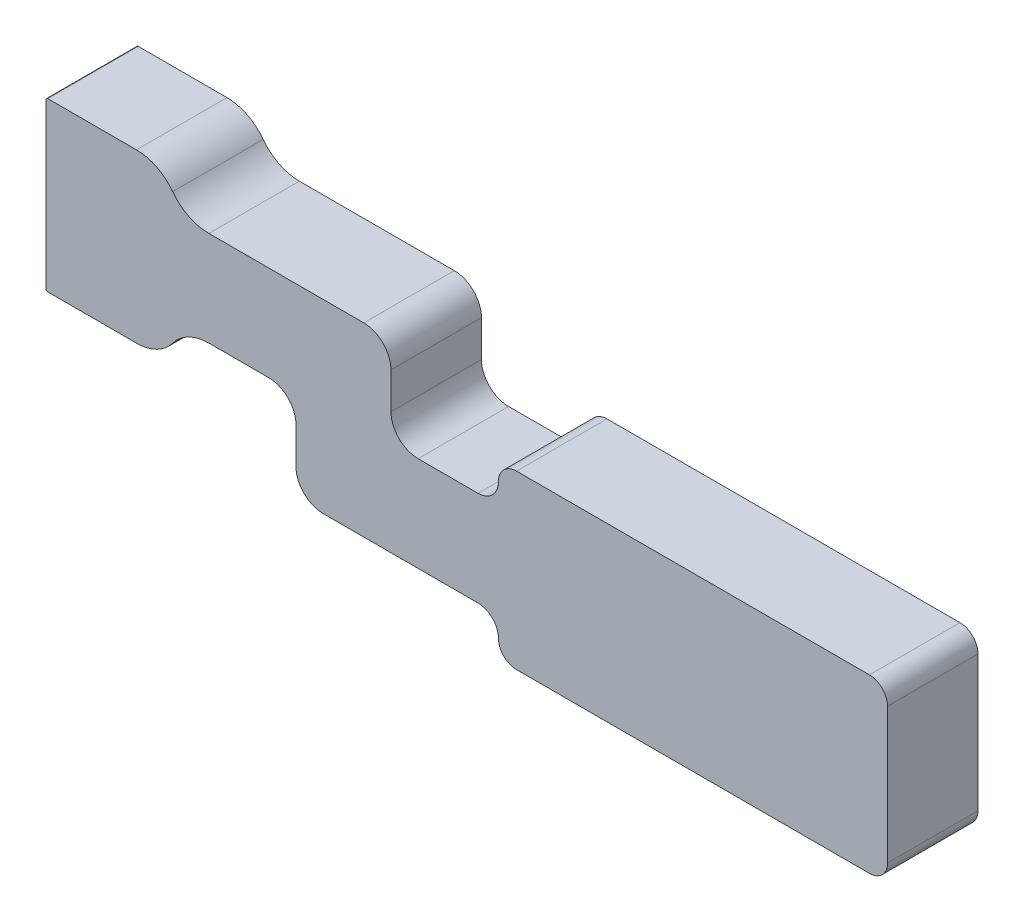
ISO-10303-21;
HEADER;
FILE_DESCRIPTION(('STEP AP214'),'2;1');
FILE_NAME('part.step','',(''),(''),'','','');
FILE_SCHEMA(('AUTOMOTIVE_DESIGN { 1 0 10303 214 1 1 1 1 }'));
ENDSEC;
DATA;
#1=APPLICATION_CONTEXT('core data for automotive mechanical design processes');
#2=APPLICATION_PROTOCOL_DEFINITION('international standard','automotive_design',2000,#1);
#3=PRODUCT_CONTEXT('',#1,'mechanical');
#4=PRODUCT('Part','Part','',(#3));
#5=PRODUCT_RELATED_PRODUCT_CATEGORY('part','',(#4));
#6=PRODUCT_DEFINITION_FORMATION('','',#4);
#7=PRODUCT_DEFINITION_CONTEXT('part definition',#1,'design');
#8=PRODUCT_DEFINITION('design','',#6,#7);
#9=PRODUCT_DEFINITION_SHAPE('','',#8);
#10=(LENGTH_UNIT() NAMED_UNIT(*) SI_UNIT(.MILLI.,.METRE.));
#11=(NAMED_UNIT(*) PLANE_ANGLE_UNIT() SI_UNIT($,.RADIAN.));
#12=(NAMED_UNIT(*) SI_UNIT($,.STERADIAN.) SOLID_ANGLE_UNIT());
#13=UNCERTAINTY_MEASURE_WITH_UNIT(LENGTH_MEASURE(1.E-05),#10,'distance_accuracy_value','');
#14=(GEOMETRIC_REPRESENTATION_CONTEXT(3) GLOBAL_UNCERTAINTY_ASSIGNED_CONTEXT((#13)) GLOBAL_UNIT_ASSIGNED_CONTEXT((#10,
#11,#12)) REPRESENTATION_CONTEXT('',''));
#15=CARTESIAN_POINT('',(0.,0.,0.));
#16=DIRECTION('',(0.,0.,1.));
#17=DIRECTION('',(1.,0.,0.));
#18=AXIS2_PLACEMENT_3D('',#15,#16,#17);
#19=CARTESIAN_POINT('',(3.40749254209706E-13,19.2499999999986,10.));
#20=DIRECTION('',(0.,-1.,0.));
#21=DIRECTION('',(1.,0.,0.));
#22=AXIS2_PLACEMENT_3D('',#19,#20,#21);
#23=PLANE('',#22);
#24=DIRECTION('',(-1.,0.,0.));
#25=VECTOR('',#24,1.);
#26=CARTESIAN_POINT('',(3.40749254209706E-13,19.2499999999986,0.));
#27=LINE('',#26,#25);
#28=CARTESIAN_POINT('',(-83.,19.25,0.));
#29=VERTEX_POINT('',#28);
#30=CARTESIAN_POINT('',(-92.8,19.2500000000002,0.));
#31=VERTEX_POINT('',#30);
#32=EDGE_CURVE('E260',#29,#31,#27,.T.);
#33=ORIENTED_EDGE('',*,*,#32,.T.);
#34=DIRECTION('',(0.,0.,-1.));
#35=VECTOR('',#34,1.);
#36=CARTESIAN_POINT('',(-92.8,19.2500000000002,10.));
#37=LINE('',#36,#35);
#38=CARTESIAN_POINT('',(-92.8,19.2500000000002,10.));
#39=VERTEX_POINT('',#38);
#40=EDGE_CURVE('E11',#39,#31,#37,.T.);
#41=ORIENTED_EDGE('',*,*,#40,.F.);
#42=DIRECTION('',(-1.,0.,0.));
#43=VECTOR('',#42,1.);
#44=CARTESIAN_POINT('',(3.40749254209706E-13,19.2499999999986,10.));
#45=LINE('',#44,#43);
#46=CARTESIAN_POINT('',(-83.,19.25,10.));
#47=VERTEX_POINT('',#46);
#48=EDGE_CURVE('E324',#47,#39,#45,.T.);
#49=ORIENTED_EDGE('',*,*,#48,.F.);
#50=DIRECTION('',(0.,0.,-1.));
#51=VECTOR('',#50,1.);
#52=CARTESIAN_POINT('',(-83.,19.25,10.));
#53=LINE('',#52,#51);
#54=EDGE_CURVE('E251',#47,#29,#53,.T.);
#55=ORIENTED_EDGE('',*,*,#54,.T.);
#56=EDGE_LOOP('',(#33,#41,#49,#55));
#57=FACE_BOUND('',#56,.T.);
#58=ADVANCED_FACE('F41',(#57),#23,.F.);
#59=CARTESIAN_POINT('',(-92.8,19.0500000000002,10.));
#60=DIRECTION('',(0.,0.,-1.));
#61=DIRECTION('',(-1.,0.,0.));
#62=AXIS2_PLACEMENT_3D('',#59,#60,#61);
#63=CYLINDRICAL_SURFACE('',#62,0.200000000000004);
#64=CARTESIAN_POINT('',(-92.8,19.0500000000002,0.));
#65=DIRECTION('',(0.,0.,1.));
#66=DIRECTION('',(1.,0.,0.));
#67=AXIS2_PLACEMENT_3D('',#64,#65,#66);
#68=CIRCLE('',#67,0.200000000000004);
#69=CARTESIAN_POINT('',(-93.,19.0500000000002,0.));
#70=VERTEX_POINT('',#69);
#71=EDGE_CURVE('E257',#31,#70,#68,.T.);
#72=ORIENTED_EDGE('',*,*,#71,.T.);
#73=DIRECTION('',(0.,0.,-1.));
#74=VECTOR('',#73,1.);
#75=CARTESIAN_POINT('',(-93.,19.0500000000002,10.));
#76=LINE('',#75,#74);
#77=CARTESIAN_POINT('',(-93.,19.0500000000002,10.));
#78=VERTEX_POINT('',#77);
#79=EDGE_CURVE('E47',#78,#70,#76,.T.);
#80=ORIENTED_EDGE('',*,*,#79,.F.);
#81=CARTESIAN_POINT('',(-92.8,19.0500000000002,10.));
#82=DIRECTION('',(0.,0.,1.));
#83=DIRECTION('',(1.,0.,0.));
#84=AXIS2_PLACEMENT_3D('',#81,#82,#83);
#85=CIRCLE('',#84,0.200000000000004);
#86=EDGE_CURVE('E159',#39,#78,#85,.T.);
#87=ORIENTED_EDGE('',*,*,#86,.F.);
#88=ORIENTED_EDGE('',*,*,#40,.T.);
#89=EDGE_LOOP('',(#72,#80,#87,#88));
#90=FACE_BOUND('',#89,.T.);
#91=ADVANCED_FACE('F474',(#90),#63,.T.);
#92=CARTESIAN_POINT('',(-93.,0.,10.));
#93=DIRECTION('',(1.,0.,0.));
#94=DIRECTION('',(0.,0.,-1.));
#95=AXIS2_PLACEMENT_3D('',#92,#93,#94);
#96=PLANE('',#95);
#97=DIRECTION('',(0.,-1.,0.));
#98=VECTOR('',#97,1.);
#99=CARTESIAN_POINT('',(-93.,0.,0.));
#100=LINE('',#99,#98);
#101=CARTESIAN_POINT('',(-93.,0.950000000000041,0.));
#102=VERTEX_POINT('',#101);
#103=EDGE_CURVE('E265',#70,#102,#100,.T.);
#104=ORIENTED_EDGE('',*,*,#103,.T.);
#105=DIRECTION('',(0.,0.,-1.));
#106=VECTOR('',#105,1.);
#107=CARTESIAN_POINT('',(-93.,0.950000000000041,10.));
#108=LINE('',#107,#106);
#109=CARTESIAN_POINT('',(-93.,0.950000000000041,10.));
#110=VERTEX_POINT('',#109);
#111=EDGE_CURVE('E377',#110,#102,#108,.T.);
#112=ORIENTED_EDGE('',*,*,#111,.F.);
#113=DIRECTION('',(0.,-1.,0.));
#114=VECTOR('',#113,1.);
#115=CARTESIAN_POINT('',(-93.,0.,10.));
#116=LINE('',#115,#114);
#117=EDGE_CURVE('E387',#78,#110,#116,.T.);
#118=ORIENTED_EDGE('',*,*,#117,.F.);
#119=ORIENTED_EDGE('',*,*,#79,.T.);
#120=EDGE_LOOP('',(#104,#112,#118,#119));
#121=FACE_BOUND('',#120,.T.);
#122=ADVANCED_FACE('F383',(#121),#96,.F.);
#123=CARTESIAN_POINT('',(-92.8,0.950000000000039,10.));
#124=DIRECTION('',(0.,0.,-1.));
#125=DIRECTION('',(-1.,0.,0.));
#126=AXIS2_PLACEMENT_3D('',#123,#124,#125);
#127=CYLINDRICAL_SURFACE('',#126,0.200000000000003);
#128=CARTESIAN_POINT('',(-92.8,0.950000000000039,0.));
#129=DIRECTION('',(0.,0.,1.));
#130=DIRECTION('',(1.,0.,0.));
#131=AXIS2_PLACEMENT_3D('',#128,#129,#130);
#132=CIRCLE('',#131,0.200000000000003);
#133=CARTESIAN_POINT('',(-92.8,0.750000000000039,0.));
#134=VERTEX_POINT('',#133);
#135=EDGE_CURVE('E264',#134,#102,#132,.F.);
#136=ORIENTED_EDGE('',*,*,#135,.F.);
#137=DIRECTION('',(0.,0.,-1.));
#138=VECTOR('',#137,1.);
#139=CARTESIAN_POINT('',(-92.8,0.750000000000039,10.));
#140=LINE('',#139,#138);
#141=CARTESIAN_POINT('',(-92.8,0.750000000000039,10.));
#142=VERTEX_POINT('',#141);
#143=EDGE_CURVE('E380',#142,#134,#140,.T.);
#144=ORIENTED_EDGE('',*,*,#143,.F.);
#145=CARTESIAN_POINT('',(-92.8,0.950000000000039,10.));
#146=DIRECTION('',(0.,0.,1.));
#147=DIRECTION('',(1.,0.,0.));
#148=AXIS2_PLACEMENT_3D('',#145,#146,#147);
#149=CIRCLE('',#148,0.200000000000003);
#150=EDGE_CURVE('E398',#142,#110,#149,.F.);
#151=ORIENTED_EDGE('',*,*,#150,.T.);
#152=ORIENTED_EDGE('',*,*,#111,.T.);
#153=EDGE_LOOP('',(#136,#144,#151,#152));
#154=FACE_BOUND('',#153,.T.);
#155=ADVANCED_FACE('F394',(#154),#127,.T.);
#156=CARTESIAN_POINT('',(0.,0.750000000000039,10.));
#157=DIRECTION('',(0.,-1.,0.));
#158=DIRECTION('',(0.,0.,-1.));
#159=AXIS2_PLACEMENT_3D('',#156,#157,#158);
#160=PLANE('',#159);
#161=DIRECTION('',(-1.,0.,0.));
#162=VECTOR('',#161,1.);
#163=CARTESIAN_POINT('',(0.,0.750000000000039,0.));
#164=LINE('',#163,#162);
#165=CARTESIAN_POINT('',(-83.,0.750000000000039,0.));
#166=VERTEX_POINT('',#165);
#167=EDGE_CURVE('E268',#166,#134,#164,.T.);
#168=ORIENTED_EDGE('',*,*,#167,.F.);
#169=DIRECTION('',(0.,0.,-1.));
#170=VECTOR('',#169,1.);
#171=CARTESIAN_POINT('',(-83.,0.750000000000039,10.));
#172=LINE('',#171,#170);
#173=CARTESIAN_POINT('',(-83.,0.750000000000039,10.));
#174=VERTEX_POINT('',#173);
#175=EDGE_CURVE('E374',#174,#166,#172,.T.);
#176=ORIENTED_EDGE('',*,*,#175,.F.);
#177=DIRECTION('',(-1.,0.,0.));
#178=VECTOR('',#177,1.);
#179=CARTESIAN_POINT('',(0.,0.750000000000039,10.));
#180=LINE('',#179,#178);
#181=EDGE_CURVE('E399',#174,#142,#180,.T.);
#182=ORIENTED_EDGE('',*,*,#181,.T.);
#183=ORIENTED_EDGE('',*,*,#143,.T.);
#184=EDGE_LOOP('',(#168,#176,#182,#183));
#185=FACE_BOUND('',#184,.T.);
#186=ADVANCED_FACE('F486',(#185),#160,.T.);
#187=CARTESIAN_POINT('',(-83.,5.75000000000004,10.));
#188=DIRECTION('',(0.,0.,-1.));
#189=DIRECTION('',(-1.,0.,0.));
#190=AXIS2_PLACEMENT_3D('',#187,#188,#189);
#191=CYLINDRICAL_SURFACE('',#190,5.);
#192=CARTESIAN_POINT('',(-83.,5.75000000000004,0.));
#193=DIRECTION('',(0.,0.,1.));
#194=DIRECTION('',(1.,0.,0.));
#195=AXIS2_PLACEMENT_3D('',#192,#193,#194);
#196=CIRCLE('',#195,5.);
#197=CARTESIAN_POINT('',(-79.,2.75000000000004,0.));
#198=VERTEX_POINT('',#197);
#199=EDGE_CURVE('E271',#198,#166,#196,.F.);
#200=ORIENTED_EDGE('',*,*,#199,.F.);
#201=DIRECTION('',(0.,0.,-1.));
#202=VECTOR('',#201,1.);
#203=CARTESIAN_POINT('',(-79.,2.75000000000004,10.));
#204=LINE('',#203,#202);
#205=CARTESIAN_POINT('',(-79.,2.75000000000004,10.));
#206=VERTEX_POINT('',#205);
#207=EDGE_CURVE('E373',#206,#198,#204,.T.);
#208=ORIENTED_EDGE('',*,*,#207,.F.);
#209=CARTESIAN_POINT('',(-83.,5.75000000000004,10.));
#210=DIRECTION('',(0.,0.,1.));
#211=DIRECTION('',(1.,0.,0.));
#212=AXIS2_PLACEMENT_3D('',#209,#210,#211);
#213=CIRCLE('',#212,5.);
#214=EDGE_CURVE('E402',#206,#174,#213,.F.);
#215=ORIENTED_EDGE('',*,*,#214,.T.);
#216=ORIENTED_EDGE('',*,*,#175,.T.);
#217=EDGE_LOOP('',(#200,#208,#215,#216));
#218=FACE_BOUND('',#217,.T.);
#219=ADVANCED_FACE('F487',(#218),#191,.T.);
#220=CARTESIAN_POINT('',(-75.,-0.249999999999962,10.));
#221=DIRECTION('',(0.,0.,-1.));
#222=DIRECTION('',(-1.,0.,0.));
#223=AXIS2_PLACEMENT_3D('',#220,#221,#222);
#224=CYLINDRICAL_SURFACE('',#223,5.);
#225=CARTESIAN_POINT('',(-75.,-0.249999999999962,0.));
#226=DIRECTION('',(0.,0.,1.));
#227=DIRECTION('',(1.,0.,0.));
#228=AXIS2_PLACEMENT_3D('',#225,#226,#227);
#229=CIRCLE('',#228,5.);
#230=CARTESIAN_POINT('',(-75.,4.75000000000004,0.));
#231=VERTEX_POINT('',#230);
#232=EDGE_CURVE('E273',#231,#198,#229,.T.);
#233=ORIENTED_EDGE('',*,*,#232,.F.);
#234=DIRECTION('',(0.,0.,-1.));
#235=VECTOR('',#234,1.);
#236=CARTESIAN_POINT('',(-75.,4.75000000000004,10.));
#237=LINE('',#236,#235);
#238=CARTESIAN_POINT('',(-75.,4.75000000000004,10.));
#239=VERTEX_POINT('',#238);
#240=EDGE_CURVE('E371',#239,#231,#237,.T.);
#241=ORIENTED_EDGE('',*,*,#240,.F.);
#242=CARTESIAN_POINT('',(-75.,-0.249999999999962,10.));
#243=DIRECTION('',(0.,0.,1.));
#244=DIRECTION('',(1.,0.,0.));
#245=AXIS2_PLACEMENT_3D('',#242,#243,#244);
#246=CIRCLE('',#245,5.);
#247=EDGE_CURVE('E409',#239,#206,#246,.T.);
#248=ORIENTED_EDGE('',*,*,#247,.T.);
#249=ORIENTED_EDGE('',*,*,#207,.T.);
#250=EDGE_LOOP('',(#233,#241,#248,#249));
#251=FACE_BOUND('',#250,.T.);
#252=ADVANCED_FACE('F492',(#251),#224,.F.);
#253=CARTESIAN_POINT('',(0.,4.75000000000004,10.));
#254=DIRECTION('',(0.,1.,0.));
#255=DIRECTION('',(0.,0.,1.));
#256=AXIS2_PLACEMENT_3D('',#253,#254,#255);
#257=PLANE('',#256);
#258=DIRECTION('',(1.,0.,0.));
#259=VECTOR('',#258,1.);
#260=CARTESIAN_POINT('',(0.,4.75000000000004,0.));
#261=LINE('',#260,#259);
#262=CARTESIAN_POINT('',(-68.375,4.75000000000004,0.));
#263=VERTEX_POINT('',#262);
#264=EDGE_CURVE('E280',#231,#263,#261,.T.);
#265=ORIENTED_EDGE('',*,*,#264,.T.);
#266=DIRECTION('',(0.,0.,-1.));
#267=VECTOR('',#266,1.);
#268=CARTESIAN_POINT('',(-68.375,4.75000000000004,10.));
#269=LINE('',#268,#267);
#270=CARTESIAN_POINT('',(-68.375,4.75000000000004,10.));
#271=VERTEX_POINT('',#270);
#272=EDGE_CURVE('E369',#271,#263,#269,.T.);
#273=ORIENTED_EDGE('',*,*,#272,.F.);
#274=DIRECTION('',(1.,0.,0.));
#275=VECTOR('',#274,1.);
#276=CARTESIAN_POINT('',(0.,4.75000000000004,10.));
#277=LINE('',#276,#275);
#278=EDGE_CURVE('E413',#239,#271,#277,.T.);
#279=ORIENTED_EDGE('',*,*,#278,.F.);
#280=ORIENTED_EDGE('',*,*,#240,.T.);
#281=EDGE_LOOP('',(#265,#273,#279,#280));
#282=FACE_BOUND('',#281,.T.);
#283=ADVANCED_FACE('F500',(#282),#257,.F.);
#284=CARTESIAN_POINT('',(-68.375,1.75000000000004,10.));
#285=DIRECTION('',(0.,0.,-1.));
#286=DIRECTION('',(-1.,0.,0.));
#287=AXIS2_PLACEMENT_3D('',#284,#285,#286);
#288=CYLINDRICAL_SURFACE('',#287,3.00000000000001);
#289=CARTESIAN_POINT('',(-68.375,1.75000000000004,0.));
#290=DIRECTION('',(0.,0.,1.));
#291=DIRECTION('',(1.,0.,0.));
#292=AXIS2_PLACEMENT_3D('',#289,#290,#291);
#293=CIRCLE('',#292,3.00000000000001);
#294=CARTESIAN_POINT('',(-65.375,1.75000000000004,0.));
#295=VERTEX_POINT('',#294);
#296=EDGE_CURVE('E278',#295,#263,#293,.T.);
#297=ORIENTED_EDGE('',*,*,#296,.F.);
#298=DIRECTION('',(0.,0.,-1.));
#299=VECTOR('',#298,1.);
#300=CARTESIAN_POINT('',(-65.375,1.75000000000004,10.));
#301=LINE('',#300,#299);
#302=CARTESIAN_POINT('',(-65.375,1.75000000000004,10.));
#303=VERTEX_POINT('',#302);
#304=EDGE_CURVE('E370',#303,#295,#301,.T.);
#305=ORIENTED_EDGE('',*,*,#304,.F.);
#306=CARTESIAN_POINT('',(-68.375,1.75000000000004,10.));
#307=DIRECTION('',(0.,0.,1.));
#308=DIRECTION('',(1.,0.,0.));
#309=AXIS2_PLACEMENT_3D('',#306,#307,#308);
#310=CIRCLE('',#309,3.00000000000001);
#311=EDGE_CURVE('E411',#303,#271,#310,.T.);
#312=ORIENTED_EDGE('',*,*,#311,.T.);
#313=ORIENTED_EDGE('',*,*,#272,.T.);
#314=EDGE_LOOP('',(#297,#305,#312,#313));
#315=FACE_BOUND('',#314,.T.);
#316=ADVANCED_FACE('F502',(#315),#288,.F.);
#317=CARTESIAN_POINT('',(-65.375,0.,10.));
#318=DIRECTION('',(1.,0.,0.));
#319=DIRECTION('',(0.,0.,-1.));
#320=AXIS2_PLACEMENT_3D('',#317,#318,#319);
#321=PLANE('',#320);
#322=DIRECTION('',(0.,-1.,0.));
#323=VECTOR('',#322,1.);
#324=CARTESIAN_POINT('',(-65.375,0.,0.));
#325=LINE('',#324,#323);
#326=CARTESIAN_POINT('',(-65.375,-2.25000000000006,0.));
#327=VERTEX_POINT('',#326);
#328=EDGE_CURVE('E284',#295,#327,#325,.T.);
#329=ORIENTED_EDGE('',*,*,#328,.T.);
#330=DIRECTION('',(0.,0.,-1.));
#331=VECTOR('',#330,1.);
#332=CARTESIAN_POINT('',(-65.375,-2.25000000000006,10.));
#333=LINE('',#332,#331);
#334=CARTESIAN_POINT('',(-65.375,-2.25000000000006,10.));
#335=VERTEX_POINT('',#334);
#336=EDGE_CURVE('E364',#335,#327,#333,.T.);
#337=ORIENTED_EDGE('',*,*,#336,.F.);
#338=DIRECTION('',(0.,-1.,0.));
#339=VECTOR('',#338,1.);
#340=CARTESIAN_POINT('',(-65.375,0.,10.));
#341=LINE('',#340,#339);
#342=EDGE_CURVE('E418',#303,#335,#341,.T.);
#343=ORIENTED_EDGE('',*,*,#342,.F.);
#344=ORIENTED_EDGE('',*,*,#304,.T.);
#345=EDGE_LOOP('',(#329,#337,#343,#344));
#346=FACE_BOUND('',#345,.T.);
#347=ADVANCED_FACE('F503',(#346),#321,.F.);
#348=CARTESIAN_POINT('',(-62.375,-2.25000000000006,10.));
#349=DIRECTION('',(0.,0.,-1.));
#350=DIRECTION('',(-1.,0.,0.));
#351=AXIS2_PLACEMENT_3D('',#348,#349,#350);
#352=CYLINDRICAL_SURFACE('',#351,3.);
#353=CARTESIAN_POINT('',(-62.375,-2.25000000000006,0.));
#354=DIRECTION('',(0.,0.,1.));
#355=DIRECTION('',(1.,0.,0.));
#356=AXIS2_PLACEMENT_3D('',#353,#354,#355);
#357=CIRCLE('',#356,3.);
#358=CARTESIAN_POINT('',(-62.375,-5.25000000000006,0.));
#359=VERTEX_POINT('',#358);
#360=EDGE_CURVE('E288',#359,#327,#357,.F.);
#361=ORIENTED_EDGE('',*,*,#360,.F.);
#362=DIRECTION('',(0.,0.,-1.));
#363=VECTOR('',#362,1.);
#364=CARTESIAN_POINT('',(-62.375,-5.25000000000006,10.));
#365=LINE('',#364,#363);
#366=CARTESIAN_POINT('',(-62.375,-5.25000000000006,10.));
#367=VERTEX_POINT('',#366);
#368=EDGE_CURVE('E361',#367,#359,#365,.T.);
#369=ORIENTED_EDGE('',*,*,#368,.F.);
#370=CARTESIAN_POINT('',(-62.375,-2.25000000000006,10.));
#371=DIRECTION('',(0.,0.,1.));
#372=DIRECTION('',(1.,0.,0.));
#373=AXIS2_PLACEMENT_3D('',#370,#371,#372);
#374=CIRCLE('',#373,3.);
#375=EDGE_CURVE('E416',#367,#335,#374,.F.);
#376=ORIENTED_EDGE('',*,*,#375,.T.);
#377=ORIENTED_EDGE('',*,*,#336,.T.);
#378=EDGE_LOOP('',(#361,#369,#376,#377));
#379=FACE_BOUND('',#378,.T.);
#380=ADVANCED_FACE('F509',(#379),#352,.T.);
#381=CARTESIAN_POINT('',(0.,-5.25000000000009,10.));
#382=DIRECTION('',(0.,1.,0.));
#383=DIRECTION('',(-1.,0.,0.));
#384=AXIS2_PLACEMENT_3D('',#381,#382,#383);
#385=PLANE('',#384);
#386=DIRECTION('',(1.,0.,0.));
#387=VECTOR('',#386,1.);
#388=CARTESIAN_POINT('',(0.,-5.25000000000009,0.));
#389=LINE('',#388,#387);
#390=CARTESIAN_POINT('',(-45.2499999999999,-5.25000000000007,0.));
#391=VERTEX_POINT('',#390);
#392=EDGE_CURVE('E289',#359,#391,#389,.T.);
#393=ORIENTED_EDGE('',*,*,#392,.T.);
#394=DIRECTION('',(0.,0.,-1.));
#395=VECTOR('',#394,1.);
#396=CARTESIAN_POINT('',(-45.2499999999999,-5.25000000000007,10.));
#397=LINE('',#396,#395);
#398=CARTESIAN_POINT('',(-45.2499999999999,-5.25000000000007,10.));
#399=VERTEX_POINT('',#398);
#400=EDGE_CURVE('E357',#399,#391,#397,.T.);
#401=ORIENTED_EDGE('',*,*,#400,.F.);
#402=DIRECTION('',(1.,0.,0.));
#403=VECTOR('',#402,1.);
#404=CARTESIAN_POINT('',(0.,-5.25000000000009,10.));
#405=LINE('',#404,#403);
#406=EDGE_CURVE('E423',#367,#399,#405,.T.);
#407=ORIENTED_EDGE('',*,*,#406,.F.);
#408=ORIENTED_EDGE('',*,*,#368,.T.);
#409=EDGE_LOOP('',(#393,#401,#407,#408));
#410=FACE_BOUND('',#409,.T.);
#411=ADVANCED_FACE('F511',(#410),#385,.F.);
#412=CARTESIAN_POINT('',(-45.2499999999999,-7.49999999999997,10.));
#413=DIRECTION('',(0.,0.,-1.));
#414=DIRECTION('',(-1.,0.,0.));
#415=AXIS2_PLACEMENT_3D('',#412,#413,#414);
#416=CYLINDRICAL_SURFACE('',#415,2.24999999999989);
#417=CARTESIAN_POINT('',(-45.2499999999999,-7.49999999999997,0.));
#418=DIRECTION('',(0.,0.,1.));
#419=DIRECTION('',(1.,0.,0.));
#420=AXIS2_PLACEMENT_3D('',#417,#418,#419);
#421=CIRCLE('',#420,2.24999999999989);
#422=CARTESIAN_POINT('',(-43.,-7.49999999999995,0.));
#423=VERTEX_POINT('',#422);
#424=EDGE_CURVE('E292',#391,#423,#421,.F.);
#425=ORIENTED_EDGE('',*,*,#424,.T.);
#426=DIRECTION('',(0.,0.,-1.));
#427=VECTOR('',#426,1.);
#428=CARTESIAN_POINT('',(-43.,-7.49999999999995,10.));
#429=LINE('',#428,#427);
#430=CARTESIAN_POINT('',(-43.,-7.49999999999995,10.));
#431=VERTEX_POINT('',#430);
#432=EDGE_CURVE('E360',#431,#423,#429,.T.);
#433=ORIENTED_EDGE('',*,*,#432,.F.);
#434=CARTESIAN_POINT('',(-45.2499999999999,-7.49999999999997,10.));
#435=DIRECTION('',(0.,0.,1.));
#436=DIRECTION('',(1.,0.,0.));
#437=AXIS2_PLACEMENT_3D('',#434,#435,#436);
#438=CIRCLE('',#437,2.24999999999989);
#439=EDGE_CURVE('E421',#399,#431,#438,.F.);
#440=ORIENTED_EDGE('',*,*,#439,.F.);
#441=ORIENTED_EDGE('',*,*,#400,.T.);
#442=EDGE_LOOP('',(#425,#433,#440,#441));
#443=FACE_BOUND('',#442,.T.);
#444=ADVANCED_FACE('F520',(#443),#416,.F.);
#445=CARTESIAN_POINT('',(-41.,-7.49999999999996,10.));
#446=DIRECTION('',(0.,0.,-1.));
#447=DIRECTION('',(-1.,0.,0.));
#448=AXIS2_PLACEMENT_3D('',#445,#446,#447);
#449=CYLINDRICAL_SURFACE('',#448,2.);
#450=CARTESIAN_POINT('',(-41.,-7.49999999999996,0.));
#451=DIRECTION('',(0.,0.,1.));
#452=DIRECTION('',(1.,0.,0.));
#453=AXIS2_PLACEMENT_3D('',#450,#451,#452);
#454=CIRCLE('',#453,2.);
#455=CARTESIAN_POINT('',(-41.,-9.49999999999996,0.));
#456=VERTEX_POINT('',#455);
#457=EDGE_CURVE('E291',#423,#456,#454,.T.);
#458=ORIENTED_EDGE('',*,*,#457,.T.);
#459=DIRECTION('',(0.,0.,-1.));
#460=VECTOR('',#459,1.);
#461=CARTESIAN_POINT('',(-41.,-9.49999999999996,10.));
#462=LINE('',#461,#460);
#463=CARTESIAN_POINT('',(-41.,-9.49999999999996,10.));
#464=VERTEX_POINT('',#463);
#465=EDGE_CURVE('E351',#464,#456,#462,.T.);
#466=ORIENTED_EDGE('',*,*,#465,.F.);
#467=CARTESIAN_POINT('',(-41.,-7.49999999999996,10.));
#468=DIRECTION('',(0.,0.,1.));
#469=DIRECTION('',(1.,0.,0.));
#470=AXIS2_PLACEMENT_3D('',#467,#468,#469);
#471=CIRCLE('',#470,2.);
#472=EDGE_CURVE('E422',#431,#464,#471,.T.);
#473=ORIENTED_EDGE('',*,*,#472,.F.);
#474=ORIENTED_EDGE('',*,*,#432,.T.);
#475=EDGE_LOOP('',(#458,#466,#473,#474));
#476=FACE_BOUND('',#475,.T.);
#477=ADVANCED_FACE('F523',(#476),#449,.T.);
#478=CARTESIAN_POINT('',(0.,-9.5,10.));
#479=DIRECTION('',(0.,1.,0.));
#480=DIRECTION('',(-1.,0.,0.));
#481=AXIS2_PLACEMENT_3D('',#478,#479,#480);
#482=PLANE('',#481);
#483=DIRECTION('',(1.,0.,0.));
#484=VECTOR('',#483,1.);
#485=CARTESIAN_POINT('',(0.,-9.5,0.));
#486=LINE('',#485,#484);
#487=CARTESIAN_POINT('',(-2.00000000000001,-9.5,0.));
#488=VERTEX_POINT('',#487);
#489=EDGE_CURVE('E293',#456,#488,#486,.T.);
#490=ORIENTED_EDGE('',*,*,#489,.T.);
#491=DIRECTION('',(0.,0.,-1.));
#492=VECTOR('',#491,1.);
#493=CARTESIAN_POINT('',(-2.00000000000001,-9.5,10.));
#494=LINE('',#493,#492);
#495=CARTESIAN_POINT('',(-2.00000000000001,-9.5,10.));
#496=VERTEX_POINT('',#495);
#497=EDGE_CURVE('E352',#496,#488,#494,.T.);
#498=ORIENTED_EDGE('',*,*,#497,.F.);
#499=DIRECTION('',(1.,0.,0.));
#500=VECTOR('',#499,1.);
#501=CARTESIAN_POINT('',(0.,-9.5,10.));
#502=LINE('',#501,#500);
#503=EDGE_CURVE('E430',#464,#496,#502,.T.);
#504=ORIENTED_EDGE('',*,*,#503,.F.);
#505=ORIENTED_EDGE('',*,*,#465,.T.);
#506=EDGE_LOOP('',(#490,#498,#504,#505));
#507=FACE_BOUND('',#506,.T.);
#508=ADVANCED_FACE('F522',(#507),#482,.F.);
#509=CARTESIAN_POINT('',(-2.,-7.5,10.));
#510=DIRECTION('',(0.,0.,-1.));
#511=DIRECTION('',(-1.,0.,0.));
#512=AXIS2_PLACEMENT_3D('',#509,#510,#511);
#513=CYLINDRICAL_SURFACE('',#512,2.);
#514=CARTESIAN_POINT('',(-2.,-7.5,0.));
#515=DIRECTION('',(0.,0.,1.));
#516=DIRECTION('',(1.,0.,0.));
#517=AXIS2_PLACEMENT_3D('',#514,#515,#516);
#518=CIRCLE('',#517,2.);
#519=CARTESIAN_POINT('',(0.,-7.49999999999999,0.));
#520=VERTEX_POINT('',#519);
#521=EDGE_CURVE('E300',#488,#520,#518,.T.);
#522=ORIENTED_EDGE('',*,*,#521,.T.);
#523=DIRECTION('',(0.,0.,-1.));
#524=VECTOR('',#523,1.);
#525=CARTESIAN_POINT('',(0.,-7.49999999999999,10.));
#526=LINE('',#525,#524);
#527=CARTESIAN_POINT('',(0.,-7.49999999999999,10.));
#528=VERTEX_POINT('',#527);
#529=EDGE_CURVE('E346',#528,#520,#526,.T.);
#530=ORIENTED_EDGE('',*,*,#529,.F.);
#531=CARTESIAN_POINT('',(-2.,-7.5,10.));
#532=DIRECTION('',(0.,0.,1.));
#533=DIRECTION('',(1.,0.,0.));
#534=AXIS2_PLACEMENT_3D('',#531,#532,#533);
#535=CIRCLE('',#534,2.);
#536=EDGE_CURVE('E427',#496,#528,#535,.T.);
#537=ORIENTED_EDGE('',*,*,#536,.F.);
#538=ORIENTED_EDGE('',*,*,#497,.T.);
#539=EDGE_LOOP('',(#522,#530,#537,#538));
#540=FACE_BOUND('',#539,.T.);
#541=ADVANCED_FACE('F530',(#540),#513,.T.);
#542=CARTESIAN_POINT('',(0.,0.,10.));
#543=DIRECTION('',(-1.,0.,0.));
#544=DIRECTION('',(0.,0.,1.));
#545=AXIS2_PLACEMENT_3D('',#542,#543,#544);
#546=PLANE('',#545);
#547=DIRECTION('',(0.,1.,0.));
#548=VECTOR('',#547,1.);
#549=CARTESIAN_POINT('',(0.,0.,0.));
#550=LINE('',#549,#548);
#551=CARTESIAN_POINT('',(0.,7.49999999999999,0.));
#552=VERTEX_POINT('',#551);
#553=EDGE_CURVE('E296',#520,#552,#550,.T.);
#554=ORIENTED_EDGE('',*,*,#553,.T.);
#555=DIRECTION('',(0.,0.,-1.));
#556=VECTOR('',#555,1.);
#557=CARTESIAN_POINT('',(0.,7.49999999999999,10.));
#558=LINE('',#557,#556);
#559=CARTESIAN_POINT('',(0.,7.49999999999999,10.));
#560=VERTEX_POINT('',#559);
#561=EDGE_CURVE('E342',#560,#552,#558,.T.);
#562=ORIENTED_EDGE('',*,*,#561,.F.);
#563=DIRECTION('',(0.,1.,0.));
#564=VECTOR('',#563,1.);
#565=CARTESIAN_POINT('',(0.,0.,10.));
#566=LINE('',#565,#564);
#567=EDGE_CURVE('E431',#528,#560,#566,.T.);
#568=ORIENTED_EDGE('',*,*,#567,.F.);
#569=ORIENTED_EDGE('',*,*,#529,.T.);
#570=EDGE_LOOP('',(#554,#562,#568,#569));
#571=FACE_BOUND('',#570,.T.);
#572=ADVANCED_FACE('F531',(#571),#546,.F.);
#573=CARTESIAN_POINT('',(-2.,7.5,10.));
#574=DIRECTION('',(0.,0.,-1.));
#575=DIRECTION('',(-1.,0.,0.));
#576=AXIS2_PLACEMENT_3D('',#573,#574,#575);
#577=CYLINDRICAL_SURFACE('',#576,2.);
#578=CARTESIAN_POINT('',(-2.,7.5,0.));
#579=DIRECTION('',(0.,0.,1.));
#580=DIRECTION('',(1.,0.,0.));
#581=AXIS2_PLACEMENT_3D('',#578,#579,#580);
#582=CIRCLE('',#581,2.);
#583=CARTESIAN_POINT('',(-2.00000000000001,9.5,0.));
#584=VERTEX_POINT('',#583);
#585=EDGE_CURVE('E303',#552,#584,#582,.T.);
#586=ORIENTED_EDGE('',*,*,#585,.T.);
#587=DIRECTION('',(0.,0.,-1.));
#588=VECTOR('',#587,1.);
#589=CARTESIAN_POINT('',(-2.00000000000001,9.5,10.));
#590=LINE('',#589,#588);
#591=CARTESIAN_POINT('',(-2.00000000000001,9.5,10.));
#592=VERTEX_POINT('',#591);
#593=EDGE_CURVE('E341',#592,#584,#590,.T.);
#594=ORIENTED_EDGE('',*,*,#593,.F.);
#595=CARTESIAN_POINT('',(-2.,7.5,10.));
#596=DIRECTION('',(0.,0.,1.));
#597=DIRECTION('',(1.,0.,0.));
#598=AXIS2_PLACEMENT_3D('',#595,#596,#597);
#599=CIRCLE('',#598,2.);
#600=EDGE_CURVE('E433',#560,#592,#599,.T.);
#601=ORIENTED_EDGE('',*,*,#600,.F.);
#602=ORIENTED_EDGE('',*,*,#561,.T.);
#603=EDGE_LOOP('',(#586,#594,#601,#602));
#604=FACE_BOUND('',#603,.T.);
#605=ADVANCED_FACE('F540',(#604),#577,.T.);
#606=CARTESIAN_POINT('',(0.,9.5,10.));
#607=DIRECTION('',(0.,1.,0.));
#608=DIRECTION('',(-1.,0.,0.));
#609=AXIS2_PLACEMENT_3D('',#606,#607,#608);
#610=PLANE('',#609);
#611=DIRECTION('',(1.,0.,0.));
#612=VECTOR('',#611,1.);
#613=CARTESIAN_POINT('',(0.,9.5,0.));
#614=LINE('',#613,#612);
#615=CARTESIAN_POINT('',(-41.,9.49999999999994,0.));
#616=VERTEX_POINT('',#615);
#617=EDGE_CURVE('E304',#616,#584,#614,.T.);
#618=ORIENTED_EDGE('',*,*,#617,.F.);
#619=DIRECTION('',(0.,0.,-1.));
#620=VECTOR('',#619,1.);
#621=CARTESIAN_POINT('',(-41.,9.49999999999994,10.));
#622=LINE('',#621,#620);
#623=CARTESIAN_POINT('',(-41.,9.49999999999994,10.));
#624=VERTEX_POINT('',#623);
#625=EDGE_CURVE('E343',#624,#616,#622,.T.);
#626=ORIENTED_EDGE('',*,*,#625,.F.);
#627=DIRECTION('',(1.,0.,0.));
#628=VECTOR('',#627,1.);
#629=CARTESIAN_POINT('',(0.,9.5,10.));
#630=LINE('',#629,#628);
#631=EDGE_CURVE('E434',#624,#592,#630,.T.);
#632=ORIENTED_EDGE('',*,*,#631,.T.);
#633=ORIENTED_EDGE('',*,*,#593,.T.);
#634=EDGE_LOOP('',(#618,#626,#632,#633));
#635=FACE_BOUND('',#634,.T.);
#636=ADVANCED_FACE('F541',(#635),#610,.T.);
#637=CARTESIAN_POINT('',(-41.,7.50000000000005,10.));
#638=DIRECTION('',(0.,0.,-1.));
#639=DIRECTION('',(-1.,0.,0.));
#640=AXIS2_PLACEMENT_3D('',#637,#638,#639);
#641=CYLINDRICAL_SURFACE('',#640,1.99999999999995);
#642=CARTESIAN_POINT('',(-41.,7.50000000000005,0.));
#643=DIRECTION('',(0.,0.,1.));
#644=DIRECTION('',(1.,0.,0.));
#645=AXIS2_PLACEMENT_3D('',#642,#643,#644);
#646=CIRCLE('',#645,1.99999999999995);
#647=CARTESIAN_POINT('',(-42.9999999999999,7.50000000000003,0.));
#648=VERTEX_POINT('',#647);
#649=EDGE_CURVE('E307',#648,#616,#646,.F.);
#650=ORIENTED_EDGE('',*,*,#649,.F.);
#651=DIRECTION('',(0.,0.,-1.));
#652=VECTOR('',#651,1.);
#653=CARTESIAN_POINT('',(-42.9999999999999,7.50000000000003,10.));
#654=LINE('',#653,#652);
#655=CARTESIAN_POINT('',(-42.9999999999999,7.50000000000003,10.));
#656=VERTEX_POINT('',#655);
#657=EDGE_CURVE('E336',#656,#648,#654,.T.);
#658=ORIENTED_EDGE('',*,*,#657,.F.);
#659=CARTESIAN_POINT('',(-41.,7.50000000000005,10.));
#660=DIRECTION('',(0.,0.,1.));
#661=DIRECTION('',(1.,0.,0.));
#662=AXIS2_PLACEMENT_3D('',#659,#660,#661);
#663=CIRCLE('',#662,1.99999999999995);
#664=EDGE_CURVE('E437',#656,#624,#663,.F.);
#665=ORIENTED_EDGE('',*,*,#664,.T.);
#666=ORIENTED_EDGE('',*,*,#625,.T.);
#667=EDGE_LOOP('',(#650,#658,#665,#666));
#668=FACE_BOUND('',#667,.T.);
#669=ADVANCED_FACE('F544',(#668),#641,.T.);
#670=CARTESIAN_POINT('',(-45.25,7.50000000000004,10.));
#671=DIRECTION('',(0.,0.,-1.));
#672=DIRECTION('',(-1.,0.,0.));
#673=AXIS2_PLACEMENT_3D('',#670,#671,#672);
#674=CYLINDRICAL_SURFACE('',#673,2.25000000000001);
#675=CARTESIAN_POINT('',(-45.25,7.50000000000004,0.));
#676=DIRECTION('',(0.,0.,1.));
#677=DIRECTION('',(1.,0.,0.));
#678=AXIS2_PLACEMENT_3D('',#675,#676,#677);
#679=CIRCLE('',#678,2.25000000000001);
#680=CARTESIAN_POINT('',(-45.25,5.25000000000004,0.));
#681=VERTEX_POINT('',#680);
#682=EDGE_CURVE('E309',#681,#648,#679,.T.);
#683=ORIENTED_EDGE('',*,*,#682,.F.);
#684=DIRECTION('',(0.,0.,-1.));
#685=VECTOR('',#684,1.);
#686=CARTESIAN_POINT('',(-45.25,5.25000000000004,10.));
#687=LINE('',#686,#685);
#688=CARTESIAN_POINT('',(-45.25,5.25000000000004,10.));
#689=VERTEX_POINT('',#688);
#690=EDGE_CURVE('E340',#689,#681,#687,.T.);
#691=ORIENTED_EDGE('',*,*,#690,.F.);
#692=CARTESIAN_POINT('',(-45.25,7.50000000000004,10.));
#693=DIRECTION('',(0.,0.,1.));
#694=DIRECTION('',(1.,0.,0.));
#695=AXIS2_PLACEMENT_3D('',#692,#693,#694);
#696=CIRCLE('',#695,2.25000000000001);
#697=EDGE_CURVE('E442',#689,#656,#696,.T.);
#698=ORIENTED_EDGE('',*,*,#697,.T.);
#699=ORIENTED_EDGE('',*,*,#657,.T.);
#700=EDGE_LOOP('',(#683,#691,#698,#699));
#701=FACE_BOUND('',#700,.T.);
#702=ADVANCED_FACE('F548',(#701),#674,.F.);
#703=CARTESIAN_POINT('',(0.,5.25000000000002,10.));
#704=DIRECTION('',(0.,1.,0.));
#705=DIRECTION('',(-1.,0.,0.));
#706=AXIS2_PLACEMENT_3D('',#703,#704,#705);
#707=PLANE('',#706);
#708=DIRECTION('',(1.,0.,0.));
#709=VECTOR('',#708,1.);
#710=CARTESIAN_POINT('',(0.,5.25000000000002,0.));
#711=LINE('',#710,#709);
#712=CARTESIAN_POINT('',(-51.875,5.25000000000004,0.));
#713=VERTEX_POINT('',#712);
#714=EDGE_CURVE('E311',#713,#681,#711,.T.);
#715=ORIENTED_EDGE('',*,*,#714,.F.);
#716=DIRECTION('',(0.,0.,-1.));
#717=VECTOR('',#716,1.);
#718=CARTESIAN_POINT('',(-51.875,5.25000000000004,10.));
#719=LINE('',#718,#717);
#720=CARTESIAN_POINT('',(-51.875,5.25000000000004,10.));
#721=VERTEX_POINT('',#720);
#722=EDGE_CURVE('E333',#721,#713,#719,.T.);
#723=ORIENTED_EDGE('',*,*,#722,.F.);
#724=DIRECTION('',(1.,0.,0.));
#725=VECTOR('',#724,1.);
#726=CARTESIAN_POINT('',(0.,5.25000000000002,10.));
#727=LINE('',#726,#725);
#728=EDGE_CURVE('E441',#721,#689,#727,.T.);
#729=ORIENTED_EDGE('',*,*,#728,.T.);
#730=ORIENTED_EDGE('',*,*,#690,.T.);
#731=EDGE_LOOP('',(#715,#723,#729,#730));
#732=FACE_BOUND('',#731,.T.);
#733=ADVANCED_FACE('F554',(#732),#707,.T.);
#734=CARTESIAN_POINT('',(-51.875,8.25000000000005,10.));
#735=DIRECTION('',(0.,0.,-1.));
#736=DIRECTION('',(-1.,0.,0.));
#737=AXIS2_PLACEMENT_3D('',#734,#735,#736);
#738=CYLINDRICAL_SURFACE('',#737,3.);
#739=CARTESIAN_POINT('',(-51.875,8.25000000000005,0.));
#740=DIRECTION('',(0.,0.,1.));
#741=DIRECTION('',(1.,0.,0.));
#742=AXIS2_PLACEMENT_3D('',#739,#740,#741);
#743=CIRCLE('',#742,3.);
#744=CARTESIAN_POINT('',(-54.875,8.25000000000005,0.));
#745=VERTEX_POINT('',#744);
#746=EDGE_CURVE('E316',#713,#745,#743,.F.);
#747=ORIENTED_EDGE('',*,*,#746,.T.);
#748=DIRECTION('',(0.,0.,-1.));
#749=VECTOR('',#748,1.);
#750=CARTESIAN_POINT('',(-54.875,8.25000000000005,10.));
#751=LINE('',#750,#749);
#752=CARTESIAN_POINT('',(-54.875,8.25000000000005,10.));
#753=VERTEX_POINT('',#752);
#754=EDGE_CURVE('E335',#753,#745,#751,.T.);
#755=ORIENTED_EDGE('',*,*,#754,.F.);
#756=CARTESIAN_POINT('',(-51.875,8.25000000000005,10.));
#757=DIRECTION('',(0.,0.,1.));
#758=DIRECTION('',(1.,0.,0.));
#759=AXIS2_PLACEMENT_3D('',#756,#757,#758);
#760=CIRCLE('',#759,3.);
#761=EDGE_CURVE('E450',#721,#753,#760,.F.);
#762=ORIENTED_EDGE('',*,*,#761,.F.);
#763=ORIENTED_EDGE('',*,*,#722,.T.);
#764=EDGE_LOOP('',(#747,#755,#762,#763));
#765=FACE_BOUND('',#764,.T.);
#766=ADVANCED_FACE('F560',(#765),#738,.F.);
#767=CARTESIAN_POINT('',(-54.875,0.,10.));
#768=DIRECTION('',(-1.,0.,0.));
#769=DIRECTION('',(0.,0.,1.));
#770=AXIS2_PLACEMENT_3D('',#767,#768,#769);
#771=PLANE('',#770);
#772=DIRECTION('',(0.,1.,0.));
#773=VECTOR('',#772,1.);
#774=CARTESIAN_POINT('',(-54.875,0.,0.));
#775=LINE('',#774,#773);
#776=CARTESIAN_POINT('',(-54.875,12.25,0.));
#777=VERTEX_POINT('',#776);
#778=EDGE_CURVE('E318',#745,#777,#775,.T.);
#779=ORIENTED_EDGE('',*,*,#778,.T.);
#780=DIRECTION('',(0.,0.,-1.));
#781=VECTOR('',#780,1.);
#782=CARTESIAN_POINT('',(-54.875,12.25,10.));
#783=LINE('',#782,#781);
#784=CARTESIAN_POINT('',(-54.875,12.25,10.));
#785=VERTEX_POINT('',#784);
#786=EDGE_CURVE('E328',#785,#777,#783,.T.);
#787=ORIENTED_EDGE('',*,*,#786,.F.);
#788=DIRECTION('',(0.,1.,0.));
#789=VECTOR('',#788,1.);
#790=CARTESIAN_POINT('',(-54.875,0.,10.));
#791=LINE('',#790,#789);
#792=EDGE_CURVE('E446',#753,#785,#791,.T.);
#793=ORIENTED_EDGE('',*,*,#792,.F.);
#794=ORIENTED_EDGE('',*,*,#754,.T.);
#795=EDGE_LOOP('',(#779,#787,#793,#794));
#796=FACE_BOUND('',#795,.T.);
#797=ADVANCED_FACE('F457',(#796),#771,.F.);
#798=CARTESIAN_POINT('',(-57.875,12.25,10.));
#799=DIRECTION('',(0.,0.,-1.));
#800=DIRECTION('',(-1.,0.,0.));
#801=AXIS2_PLACEMENT_3D('',#798,#799,#800);
#802=CYLINDRICAL_SURFACE('',#801,3.);
#803=CARTESIAN_POINT('',(-57.875,12.25,0.));
#804=DIRECTION('',(0.,0.,1.));
#805=DIRECTION('',(1.,0.,0.));
#806=AXIS2_PLACEMENT_3D('',#803,#804,#805);
#807=CIRCLE('',#806,3.);
#808=CARTESIAN_POINT('',(-57.875,15.25,0.));
#809=VERTEX_POINT('',#808);
#810=EDGE_CURVE('E319',#777,#809,#807,.T.);
#811=ORIENTED_EDGE('',*,*,#810,.T.);
#812=DIRECTION('',(0.,0.,-1.));
#813=VECTOR('',#812,1.);
#814=CARTESIAN_POINT('',(-57.875,15.25,10.));
#815=LINE('',#814,#813);
#816=CARTESIAN_POINT('',(-57.875,15.25,10.));
#817=VERTEX_POINT('',#816);
#818=EDGE_CURVE('E246',#817,#809,#815,.T.);
#819=ORIENTED_EDGE('',*,*,#818,.F.);
#820=CARTESIAN_POINT('',(-57.875,12.25,10.));
#821=DIRECTION('',(0.,0.,1.));
#822=DIRECTION('',(1.,0.,0.));
#823=AXIS2_PLACEMENT_3D('',#820,#821,#822);
#824=CIRCLE('',#823,3.);
#825=EDGE_CURVE('E239',#785,#817,#824,.T.);
#826=ORIENTED_EDGE('',*,*,#825,.F.);
#827=ORIENTED_EDGE('',*,*,#786,.T.);
#828=EDGE_LOOP('',(#811,#819,#826,#827));
#829=FACE_BOUND('',#828,.T.);
#830=ADVANCED_FACE('F458',(#829),#802,.T.);
#831=CARTESIAN_POINT('',(0.,15.25,10.));
#832=DIRECTION('',(0.,-1.,0.));
#833=DIRECTION('',(1.,0.,0.));
#834=AXIS2_PLACEMENT_3D('',#831,#832,#833);
#835=PLANE('',#834);
#836=DIRECTION('',(-1.,0.,0.));
#837=VECTOR('',#836,1.);
#838=CARTESIAN_POINT('',(0.,15.25,0.));
#839=LINE('',#838,#837);
#840=CARTESIAN_POINT('',(-75.,15.25,0.));
#841=VERTEX_POINT('',#840);
#842=EDGE_CURVE('E250',#809,#841,#839,.T.);
#843=ORIENTED_EDGE('',*,*,#842,.T.);
#844=DIRECTION('',(0.,0.,-1.));
#845=VECTOR('',#844,1.);
#846=CARTESIAN_POINT('',(-75.,15.25,10.));
#847=LINE('',#846,#845);
#848=CARTESIAN_POINT('',(-75.,15.25,10.));
#849=VERTEX_POINT('',#848);
#850=EDGE_CURVE('E241',#849,#841,#847,.T.);
#851=ORIENTED_EDGE('',*,*,#850,.F.);
#852=DIRECTION('',(-1.,0.,0.));
#853=VECTOR('',#852,1.);
#854=CARTESIAN_POINT('',(0.,15.25,10.));
#855=LINE('',#854,#853);
#856=EDGE_CURVE('E231',#817,#849,#855,.T.);
#857=ORIENTED_EDGE('',*,*,#856,.F.);
#858=ORIENTED_EDGE('',*,*,#818,.T.);
#859=EDGE_LOOP('',(#843,#851,#857,#858));
#860=FACE_BOUND('',#859,.T.);
#861=ADVANCED_FACE('F243',(#860),#835,.F.);
#862=CARTESIAN_POINT('',(-75.,20.25,10.));
#863=DIRECTION('',(0.,0.,-1.));
#864=DIRECTION('',(-1.,0.,0.));
#865=AXIS2_PLACEMENT_3D('',#862,#863,#864);
#866=CYLINDRICAL_SURFACE('',#865,5.);
#867=CARTESIAN_POINT('',(-75.,20.25,0.));
#868=DIRECTION('',(0.,0.,1.));
#869=DIRECTION('',(1.,0.,0.));
#870=AXIS2_PLACEMENT_3D('',#867,#868,#869);
#871=CIRCLE('',#870,5.);
#872=CARTESIAN_POINT('',(-79.,17.25,0.));
#873=VERTEX_POINT('',#872);
#874=EDGE_CURVE('E148',#841,#873,#871,.F.);
#875=ORIENTED_EDGE('',*,*,#874,.T.);
#876=DIRECTION('',(0.,0.,-1.));
#877=VECTOR('',#876,1.);
#878=CARTESIAN_POINT('',(-79.,17.25,10.));
#879=LINE('',#878,#877);
#880=CARTESIAN_POINT('',(-79.,17.25,10.));
#881=VERTEX_POINT('',#880);
#882=EDGE_CURVE('E249',#881,#873,#879,.T.);
#883=ORIENTED_EDGE('',*,*,#882,.F.);
#884=CARTESIAN_POINT('',(-75.,20.25,10.));
#885=DIRECTION('',(0.,0.,1.));
#886=DIRECTION('',(1.,0.,0.));
#887=AXIS2_PLACEMENT_3D('',#884,#885,#886);
#888=CIRCLE('',#887,5.);
#889=EDGE_CURVE('E240',#849,#881,#888,.F.);
#890=ORIENTED_EDGE('',*,*,#889,.F.);
#891=ORIENTED_EDGE('',*,*,#850,.T.);
#892=EDGE_LOOP('',(#875,#883,#890,#891));
#893=FACE_BOUND('',#892,.T.);
#894=ADVANCED_FACE('F253',(#893),#866,.F.);
#895=CARTESIAN_POINT('',(-83.,14.25,10.));
#896=DIRECTION('',(0.,0.,-1.));
#897=DIRECTION('',(-1.,0.,0.));
#898=AXIS2_PLACEMENT_3D('',#895,#896,#897);
#899=CYLINDRICAL_SURFACE('',#898,5.);
#900=CARTESIAN_POINT('',(-83.,14.25,0.));
#901=DIRECTION('',(0.,0.,1.));
#902=DIRECTION('',(1.,0.,0.));
#903=AXIS2_PLACEMENT_3D('',#900,#901,#902);
#904=CIRCLE('',#903,5.);
#905=EDGE_CURVE('E155',#873,#29,#904,.T.);
#906=ORIENTED_EDGE('',*,*,#905,.T.);
#907=ORIENTED_EDGE('',*,*,#54,.F.);
#908=CARTESIAN_POINT('',(-83.,14.25,10.));
#909=DIRECTION('',(0.,0.,1.));
#910=DIRECTION('',(1.,0.,0.));
#911=AXIS2_PLACEMENT_3D('',#908,#909,#910);
#912=CIRCLE('',#911,5.);
#913=EDGE_CURVE('E60',#881,#47,#912,.T.);
#914=ORIENTED_EDGE('',*,*,#913,.F.);
#915=ORIENTED_EDGE('',*,*,#882,.T.);
#916=EDGE_LOOP('',(#906,#907,#914,#915));
#917=FACE_BOUND('',#916,.T.);
#918=ADVANCED_FACE('F461',(#917),#899,.T.);
#919=CARTESIAN_POINT('',(0.,0.,10.));
#920=DIRECTION('',(0.,0.,1.));
#921=DIRECTION('',(1.,0.,0.));
#922=AXIS2_PLACEMENT_3D('',#919,#920,#921);
#923=PLANE('',#922);
#924=ORIENTED_EDGE('',*,*,#48,.T.);
#925=ORIENTED_EDGE('',*,*,#86,.T.);
#926=ORIENTED_EDGE('',*,*,#117,.T.);
#927=ORIENTED_EDGE('',*,*,#150,.F.);
#928=ORIENTED_EDGE('',*,*,#181,.F.);
#929=ORIENTED_EDGE('',*,*,#214,.F.);
#930=ORIENTED_EDGE('',*,*,#247,.F.);
#931=ORIENTED_EDGE('',*,*,#278,.T.);
#932=ORIENTED_EDGE('',*,*,#311,.F.);
#933=ORIENTED_EDGE('',*,*,#342,.T.);
#934=ORIENTED_EDGE('',*,*,#375,.F.);
#935=ORIENTED_EDGE('',*,*,#406,.T.);
#936=ORIENTED_EDGE('',*,*,#439,.T.);
#937=ORIENTED_EDGE('',*,*,#472,.T.);
#938=ORIENTED_EDGE('',*,*,#503,.T.);
#939=ORIENTED_EDGE('',*,*,#536,.T.);
#940=ORIENTED_EDGE('',*,*,#567,.T.);
#941=ORIENTED_EDGE('',*,*,#600,.T.);
#942=ORIENTED_EDGE('',*,*,#631,.F.);
#943=ORIENTED_EDGE('',*,*,#664,.F.);
#944=ORIENTED_EDGE('',*,*,#697,.F.);
#945=ORIENTED_EDGE('',*,*,#728,.F.);
#946=ORIENTED_EDGE('',*,*,#761,.T.);
#947=ORIENTED_EDGE('',*,*,#792,.T.);
#948=ORIENTED_EDGE('',*,*,#825,.T.);
#949=ORIENTED_EDGE('',*,*,#856,.T.);
#950=ORIENTED_EDGE('',*,*,#889,.T.);
#951=ORIENTED_EDGE('',*,*,#913,.T.);
#952=EDGE_LOOP('',(#924,#925,#926,#927,#928,#929,#930,#931,#932,#933,#934,#935,#936,#937,#938,
#939,#940,#941,#942,#943,#944,#945,#946,#947,#948,#949,#950,#951));
#953=FACE_BOUND('',#952,.T.);
#954=ADVANCED_FACE('F232',(#953),#923,.T.);
#955=CARTESIAN_POINT('',(0.,0.,0.));
#956=DIRECTION('',(0.,0.,1.));
#957=DIRECTION('',(1.,0.,0.));
#958=AXIS2_PLACEMENT_3D('',#955,#956,#957);
#959=PLANE('',#958);
#960=ORIENTED_EDGE('',*,*,#32,.F.);
#961=ORIENTED_EDGE('',*,*,#905,.F.);
#962=ORIENTED_EDGE('',*,*,#874,.F.);
#963=ORIENTED_EDGE('',*,*,#842,.F.);
#964=ORIENTED_EDGE('',*,*,#810,.F.);
#965=ORIENTED_EDGE('',*,*,#778,.F.);
#966=ORIENTED_EDGE('',*,*,#746,.F.);
#967=ORIENTED_EDGE('',*,*,#714,.T.);
#968=ORIENTED_EDGE('',*,*,#682,.T.);
#969=ORIENTED_EDGE('',*,*,#649,.T.);
#970=ORIENTED_EDGE('',*,*,#617,.T.);
#971=ORIENTED_EDGE('',*,*,#585,.F.);
#972=ORIENTED_EDGE('',*,*,#553,.F.);
#973=ORIENTED_EDGE('',*,*,#521,.F.);
#974=ORIENTED_EDGE('',*,*,#489,.F.);
#975=ORIENTED_EDGE('',*,*,#457,.F.);
#976=ORIENTED_EDGE('',*,*,#424,.F.);
#977=ORIENTED_EDGE('',*,*,#392,.F.);
#978=ORIENTED_EDGE('',*,*,#360,.T.);
#979=ORIENTED_EDGE('',*,*,#328,.F.);
#980=ORIENTED_EDGE('',*,*,#296,.T.);
#981=ORIENTED_EDGE('',*,*,#264,.F.);
#982=ORIENTED_EDGE('',*,*,#232,.T.);
#983=ORIENTED_EDGE('',*,*,#199,.T.);
#984=ORIENTED_EDGE('',*,*,#167,.T.);
#985=ORIENTED_EDGE('',*,*,#135,.T.);
#986=ORIENTED_EDGE('',*,*,#103,.F.);
#987=ORIENTED_EDGE('',*,*,#71,.F.);
#988=EDGE_LOOP('',(#960,#961,#962,#963,#964,#965,#966,#967,#968,#969,#970,#971,#972,#973,#974,
#975,#976,#977,#978,#979,#980,#981,#982,#983,#984,#985,#986,#987));
#989=FACE_BOUND('',#988,.T.);
#990=ADVANCED_FACE('F386',(#989),#959,.F.);
#991=CLOSED_SHELL('',(#58,#91,#122,#155,#186,#219,#252,#283,#316,#347,#380,#411,#444,#477,#508,
#541,#572,#605,#636,#669,#702,#733,#766,#797,#830,#861,#894,#918,#954,#990));
#992=MANIFOLD_SOLID_BREP('B2',#991);
#993=ADVANCED_BREP_SHAPE_REPRESENTATION('',(#18,#992),#14);
#994=SHAPE_DEFINITION_REPRESENTATION(#9,#993);
ENDSEC;
END-ISO-10303-21;
